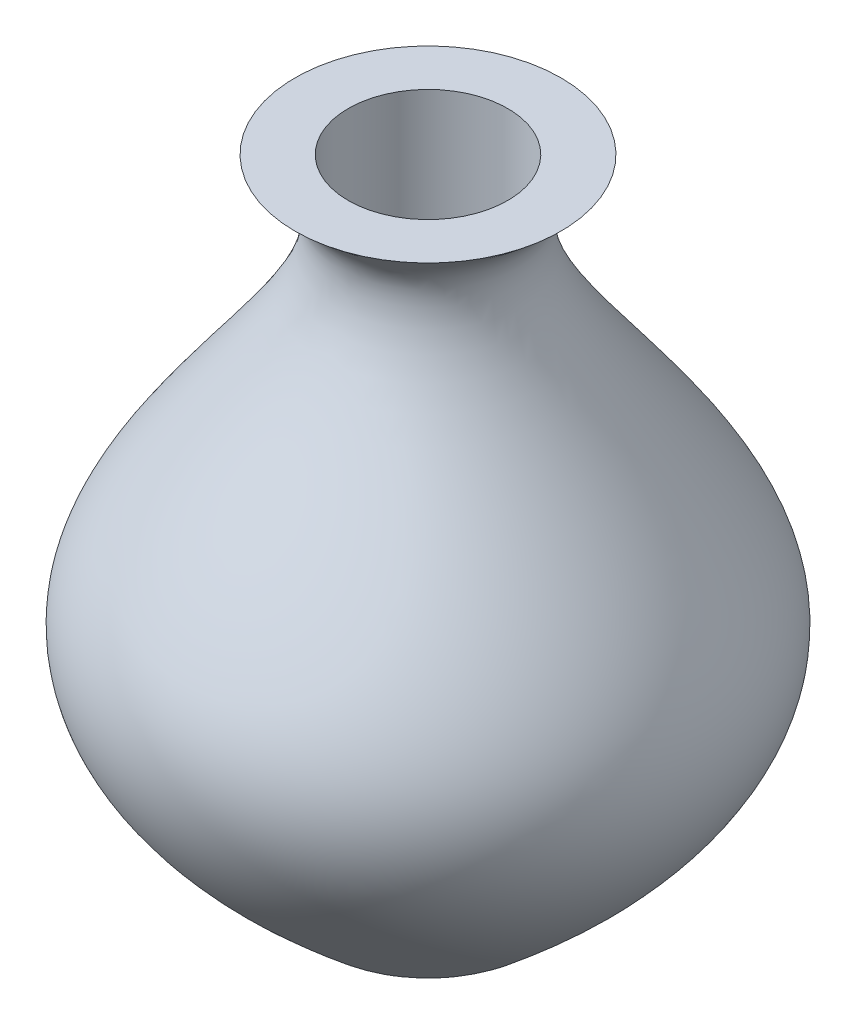
ISO-10303-21;
HEADER;
FILE_DESCRIPTION(('STEP AP214'),'2;1');
FILE_NAME('part.step','',(''),(''),'','','');
FILE_SCHEMA(('AUTOMOTIVE_DESIGN { 1 0 10303 214 1 1 1 1 }'));
ENDSEC;
DATA;
#1=APPLICATION_CONTEXT('core data for automotive mechanical design processes');
#2=APPLICATION_PROTOCOL_DEFINITION('international standard','automotive_design',2000,#1);
#3=PRODUCT_CONTEXT('',#1,'mechanical');
#4=PRODUCT('Part','Part','',(#3));
#5=PRODUCT_RELATED_PRODUCT_CATEGORY('part','',(#4));
#6=PRODUCT_DEFINITION_FORMATION('','',#4);
#7=PRODUCT_DEFINITION_CONTEXT('part definition',#1,'design');
#8=PRODUCT_DEFINITION('design','',#6,#7);
#9=PRODUCT_DEFINITION_SHAPE('','',#8);
#10=(LENGTH_UNIT() NAMED_UNIT(*) SI_UNIT(.MILLI.,.METRE.));
#11=(NAMED_UNIT(*) PLANE_ANGLE_UNIT() SI_UNIT($,.RADIAN.));
#12=(NAMED_UNIT(*) SI_UNIT($,.STERADIAN.) SOLID_ANGLE_UNIT());
#13=UNCERTAINTY_MEASURE_WITH_UNIT(LENGTH_MEASURE(1.E-05),#10,'distance_accuracy_value','');
#14=(GEOMETRIC_REPRESENTATION_CONTEXT(3) GLOBAL_UNCERTAINTY_ASSIGNED_CONTEXT((#13)) GLOBAL_UNIT_ASSIGNED_CONTEXT((#10,
#11,#12)) REPRESENTATION_CONTEXT('',''));
#15=CARTESIAN_POINT('',(0.,0.,0.));
#16=DIRECTION('',(0.,0.,1.));
#17=DIRECTION('',(1.,0.,0.));
#18=AXIS2_PLACEMENT_3D('',#15,#16,#17);
#19=CARTESIAN_POINT('',(0.,120.,0.));
#20=DIRECTION('',(0.,1.,0.));
#21=DIRECTION('',(0.,0.,1.));
#22=AXIS2_PLACEMENT_3D('',#19,#20,#21);
#23=PLANE('',#22);
#24=CARTESIAN_POINT('',(0.,120.,0.));
#25=DIRECTION('',(0.,1.,0.));
#26=DIRECTION('',(0.,0.,1.));
#27=AXIS2_PLACEMENT_3D('',#24,#25,#26);
#28=CIRCLE('',#27,15.);
#29=CARTESIAN_POINT('',(0.,120.,15.));
#30=VERTEX_POINT('',#29);
#31=EDGE_CURVE('E119',#30,#30,#28,.F.);
#32=ORIENTED_EDGE('',*,*,#31,.T.);
#33=EDGE_LOOP('',(#32));
#34=FACE_BOUND('',#33,.T.);
#35=CARTESIAN_POINT('',(0.,120.,0.));
#36=DIRECTION('',(0.,1.,0.));
#37=DIRECTION('',(0.,0.,1.));
#38=AXIS2_PLACEMENT_3D('',#35,#36,#37);
#39=CIRCLE('',#38,25.);
#40=CARTESIAN_POINT('',(0.,120.,25.));
#41=VERTEX_POINT('',#40);
#42=EDGE_CURVE('E11',#41,#41,#39,.T.);
#43=ORIENTED_EDGE('',*,*,#42,.T.);
#44=EDGE_LOOP('',(#43));
#45=FACE_BOUND('',#44,.T.);
#46=ADVANCED_FACE('F115',(#34,#45),#23,.T.);
#47=CARTESIAN_POINT('',(0.,0.,0.));
#48=DIRECTION('',(0.,1.,0.));
#49=DIRECTION('',(0.,0.,1.));
#50=AXIS2_PLACEMENT_3D('',#47,#48,#49);
#51=PLANE('',#50);
#52=CARTESIAN_POINT('',(0.,0.,0.));
#53=DIRECTION('',(0.,1.,0.));
#54=DIRECTION('',(0.,0.,1.));
#55=AXIS2_PLACEMENT_3D('',#52,#53,#54);
#56=CIRCLE('',#55,20.);
#57=CARTESIAN_POINT('',(0.,0.,20.));
#58=VERTEX_POINT('',#57);
#59=EDGE_CURVE('E123',#58,#58,#56,.T.);
#60=ORIENTED_EDGE('',*,*,#59,.F.);
#61=EDGE_LOOP('',(#60));
#62=FACE_BOUND('',#61,.T.);
#63=ADVANCED_FACE('F148',(#62),#51,.F.);
#64=CARTESIAN_POINT('',(-5.14400516611221,0.,19.3271625142185));
#65=CARTESIAN_POINT('',(-7.42194635237839,16.967937384597,39.766625762589));
#66=CARTESIAN_POINT('',(-10.9947943989979,50.3265774699418,69.8511464828441));
#67=CARTESIAN_POINT('',(2.87159985723646,99.4336032324122,9.31944506709552));
#68=CARTESIAN_POINT('',(-0.145396779369256,115.409113900686,18.9071613686045));
#69=CARTESIAN_POINT('',(-1.97713654584512,120.,24.9216959912259));
#70=CARTESIAN_POINT('',(-3.87904541415092,0.,19.6638368446705));
#71=CARTESIAN_POINT('',(-4.81919581688211,16.9679413236887,40.2523982572504));
#72=CARTESIAN_POINT('',(-6.42299583514226,50.3265729270069,70.5707610310723));
#73=CARTESIAN_POINT('',(3.48136860030306,99.4336094707994,9.131469425438));
#74=CARTESIAN_POINT('',(1.09214670084719,115.409111539105,18.9166891861028));
#75=CARTESIAN_POINT('',(-0.346015456221956,120.,25.0510992677175));
#76=CARTESIAN_POINT('',(-1.28249446036227,0.,20.0858396525019));
#77=CARTESIAN_POINT('',(0.482005136263627,16.9679397039652,40.7105737727381));
#78=CARTESIAN_POINT('',(2.86191107173391,50.32643296809,71.1111242604841));
#79=CARTESIAN_POINT('',(4.66449473363988,99.4339889754671,8.63274720272532));
#80=CARTESIAN_POINT('',(3.56849048824781,115.40896502202,18.6903331016542));
#81=CARTESIAN_POINT('',(2.94120267016632,120.,24.9874682366643));
#82=CARTESIAN_POINT('',(2.66087953735464,0.,19.9544200564198));
#83=CARTESIAN_POINT('',(8.41494993107207,16.9679505780328,39.8357981247999));
#84=CARTESIAN_POINT('',(16.6798184035074,50.3266389018482,69.1838412519339));
#85=CARTESIAN_POINT('',(6.25994129308448,99.4334176442034,7.56094624607444));
#86=CARTESIAN_POINT('',(7.14758772252509,115.409185698233,17.6383332037237));
#87=CARTESIAN_POINT('',(7.76094719073972,120.,23.9365528808286));
#88=CARTESIAN_POINT('',(6.50145431954131,0.,19.0481904038975));
#89=CARTESIAN_POINT('',(16.0245011012307,16.9679227311456,37.4273358609328));
#90=CARTESIAN_POINT('',(29.8570919840306,50.3265584976312,64.6018167623107));
#91=CARTESIAN_POINT('',(7.61322096640803,99.4336766618883,6.19296380785215));
#92=CARTESIAN_POINT('',(10.4492417997137,115.409085381841,15.9017542545208));
#93=CARTESIAN_POINT('',(12.2793430272255,120.,21.9584278528718));
#94=CARTESIAN_POINT('',(10.0946940420438,0.,17.4168335161775));
#95=CARTESIAN_POINT('',(23.0189405125275,16.9679518634664,33.5830957983455));
#96=CARTESIAN_POINT('',(41.8855653805382,50.3265932607307,57.5349482274476));
#97=CARTESIAN_POINT('',(8.67693816228554,99.4335386396055,4.58882760130199));
#98=CARTESIAN_POINT('',(13.3534504699347,115.4091390063,13.5604728692199));
#99=CARTESIAN_POINT('',(16.3303388144143,120.,19.1450167663631));
#100=CARTESIAN_POINT('',(13.2960628607081,0.,15.1100322145019));
#101=CARTESIAN_POINT('',(29.1275600220573,16.9679279126687,28.4459599063289));
#102=CARTESIAN_POINT('',(52.3064102884034,50.3265317982858,48.258770601839));
#103=CARTESIAN_POINT('',(9.40353468046937,99.4337406953524,2.80742135607709));
#104=CARTESIAN_POINT('',(15.7392435123768,115.409060724664,10.6926065331646));
#105=CARTESIAN_POINT('',(19.7478831870968,120.,15.5882432348716));
#106=CARTESIAN_POINT('',(15.9913347965985,0.,12.2282021137795));
#107=CARTESIAN_POINT('',(34.1183855090811,16.9679479125418,22.2178596653569));
#108=CARTESIAN_POINT('',(60.7149404730228,50.3266087186124,37.1262018766931));
#109=CARTESIAN_POINT('',(9.77241168022231,99.4335030152927,0.919601604587182));
#110=CARTESIAN_POINT('',(17.526347131095,115.409152711415,7.41808494881672));
#111=CARTESIAN_POINT('',(22.4138086465647,120.,11.4380283754441));
#112=CARTESIAN_POINT('',(18.066283870779,0.,8.87175882891875));
#113=CARTESIAN_POINT('',(37.7961382668,16.9679246135874,15.1340392354395));
#114=CARTESIAN_POINT('',(66.7926396726625,50.3265395950103,24.5683609237466));
#115=CARTESIAN_POINT('',(9.76214516409939,99.4337247166862,-1.00456012582283));
#116=CARTESIAN_POINT('',(18.6330100521281,115.409066853796,3.85551121868089));
#117=CARTESIAN_POINT('',(24.2099476941095,120.,6.84429330512717));
#118=CARTESIAN_POINT('',(19.4536489694016,0.,5.17761867223115));
#119=CARTESIAN_POINT('',(40.0237074076971,16.9679524758712,7.47003007181476));
#120=CARTESIAN_POINT('',(70.3007953475728,50.3266109096193,11.0656991974316));
#121=CARTESIAN_POINT('',(9.38062424359488,99.4334901621876,-2.89048272692094));
#122=CARTESIAN_POINT('',(19.0309669406534,115.409157726992,0.146360815474122));
#123=CARTESIAN_POINT('',(25.0846546702043,120.,1.99012026063089));
#124=CARTESIAN_POINT('',(20.0861689786182,0.,1.28269795602813));
#125=CARTESIAN_POINT('',(40.7106353621542,16.9679275758866,-0.481955723925191));
#126=CARTESIAN_POINT('',(71.1102514486357,50.3265393429255,-2.8621724099714));
#127=CARTESIAN_POINT('',(8.63461584252661,99.4337208837021,-4.66402959662714));
#128=CARTESIAN_POINT('',(18.6901027759906,115.409068368454,-3.5685348436849));
#129=CARTESIAN_POINT('',(24.9862839153223,120.,-2.9414085213348));
#130=CARTESIAN_POINT('',(19.9541884371488,0.,-2.66102794744871));
#131=CARTESIAN_POINT('',(39.8357296241011,16.9679504422772,-8.41497716740824));
#132=CARTESIAN_POINT('',(69.1842029064249,50.3266002746148,-16.6796793048532));
#133=CARTESIAN_POINT('',(7.56023720386086,99.433521909501,-6.26002511861989));
#134=CARTESIAN_POINT('',(17.6383816761938,115.409145447714,-7.1476396751648));
#135=CARTESIAN_POINT('',(23.9369421322354,120.,-7.76100406877463));
#136=CARTESIAN_POINT('',(19.048051883713,0.,-6.50158366595777));
#137=CARTESIAN_POINT('',(37.4272799004074,16.9679270283745,-16.0245528407614));
#138=CARTESIAN_POINT('',(64.6020271919977,50.3265350969549,-29.857029727071));
#139=CARTESIAN_POINT('',(6.19243524430079,99.4337331559427,-7.61328530709776));
#140=CARTESIAN_POINT('',(15.9017984329557,115.409063624599,-10.4492999317479));
#141=CARTESIAN_POINT('',(21.9587360237153,120.,-12.2793774096933));
#142=CARTESIAN_POINT('',(17.416946877871,0.,-10.0946807565622));
#143=CARTESIAN_POINT('',(33.5831509336434,16.9679524826826,-23.0189229264616));
#144=CARTESIAN_POINT('',(57.5347948768392,50.3266101937112,-41.8855562097003));
#145=CARTESIAN_POINT('',(4.58925635565357,99.4334920804096,-8.67690501613676));
#146=CARTESIAN_POINT('',(13.5604227221119,115.409156986592,-13.3534645423904));
#147=CARTESIAN_POINT('',(19.1447461003584,120.,-16.3303862043919));
#148=CARTESIAN_POINT('',(15.1100609791828,0.,-13.2960307763251));
#149=CARTESIAN_POINT('',(28.4459717330543,16.9679261380758,-29.1275411028062));
#150=CARTESIAN_POINT('',(48.258681995747,50.3265385626825,-52.30641670227));
#151=CARTESIAN_POINT('',(2.8076575297442,99.4337251756378,-9.40349558700191));
#152=CARTESIAN_POINT('',(10.6925547242551,115.409066694659,-15.7392306408031));
#153=CARTESIAN_POINT('',(15.5880528727608,120.,-19.7478881131714));
#154=CARTESIAN_POINT('',(12.2280903628022,0.,-15.9913595580221));
#155=CARTESIAN_POINT('',(22.2178422075221,16.9679516750316,-34.1183938483498));
#156=CARTESIAN_POINT('',(37.1263685234692,50.3265987775272,-60.7149203715058));
#157=CARTESIAN_POINT('',(0.919374856055031,99.4335240648378,-9.77241108448498));
#158=CARTESIAN_POINT('',(7.41806007000149,115.409144630282,-17.526330974786));
#159=CARTESIAN_POINT('',(11.4381019580968,120.,-22.413778856411));
#160=CARTESIAN_POINT('',(8.87173120388333,0.,-18.066392934429));
#161=CARTESIAN_POINT('',(15.134027999462,16.9679340114843,-37.7961865162484));
#162=CARTESIAN_POINT('',(24.5684023073638,50.3265341506978,-66.7925972255043));
#163=CARTESIAN_POINT('',(-1.004681267826,99.4337250686316,-9.76217145109397));
#164=CARTESIAN_POINT('',(3.855500777538,115.409066829082,-18.6330232806497));
#165=CARTESIAN_POINT('',(6.84433897354098,120.,-24.2099541544898));
#166=CARTESIAN_POINT('',(5.17770908466219,0.,-19.4537955735071));
#167=CARTESIAN_POINT('',(7.47006922685694,16.9679625456983,-40.0237739220661));
#168=CARTESIAN_POINT('',(11.0656380351637,50.326607328168,-70.3007510486447));
#169=CARTESIAN_POINT('',(-2.89037211223649,99.43348447228,-9.38064779811727));
#170=CARTESIAN_POINT('',(0.146362425427984,115.409160042525,-19.0310027499373));
#171=CARTESIAN_POINT('',(1.99006817000059,120.,-25.0846983931344));
#172=CARTESIAN_POINT('',(1.28274958737488,0.,-20.0862321432177));
#173=CARTESIAN_POINT('',(-0.481933621734429,16.9679319811622,-40.7106627789873));
#174=CARTESIAN_POINT('',(-2.86219935257105,50.3265361339217,-71.1102313961876));
#175=CARTESIAN_POINT('',(-4.66398041402687,99.433722818514,-8.63460668504873));
#176=CARTESIAN_POINT('',(-3.56851648723393,115.40906767367,-18.690108167751));
#177=CARTESIAN_POINT('',(-2.94140620161691,120.,-24.9862959580711));
#178=CARTESIAN_POINT('',(-2.66103897485741,0.,-19.9541636258976));
#179=CARTESIAN_POINT('',(-8.41500617315407,16.9679506559517,-39.8357235274815));
#180=CARTESIAN_POINT('',(-16.6797028595441,50.3265995435312,-69.1842207376661));
#181=CARTESIAN_POINT('',(-6.26009936914308,99.4335235535176,-7.56021535655989));
#182=CARTESIAN_POINT('',(-7.14760571676779,115.409144815612,-17.6383545366461));
#183=CARTESIAN_POINT('',(-7.76091856134609,120.,-23.9369129612001));
#184=CARTESIAN_POINT('',(-6.50154828891349,0.,-19.0480510038831));
#185=CARTESIAN_POINT('',(-16.0245462108774,16.9679257785871,-37.4272732154569));
#186=CARTESIAN_POINT('',(-29.8570433477478,50.3265384802488,-64.6020036758222));
#187=CARTESIAN_POINT('',(-7.61331861392753,99.433725945269,-6.19246286407034));
#188=CARTESIAN_POINT('',(-10.449259749294,115.409066393312,-15.9017923126244));
#189=CARTESIAN_POINT('',(-12.2793033292215,120.,-21.9587155144214));
#190=CARTESIAN_POINT('',(-10.0945995501676,0.,-17.4169939439974));
#191=CARTESIAN_POINT('',(-23.0188968732263,16.9679493101398,-33.5831624534461));
#192=CARTESIAN_POINT('',(-41.8856102282343,50.326613192735,-57.5347521435959));
#193=CARTESIAN_POINT('',(-8.67686445522066,99.4334888336063,-4.58930542861377));
#194=CARTESIAN_POINT('',(-13.3534335054258,115.409158202416,-13.560453148281));
#195=CARTESIAN_POINT('',(-16.3303621542,120.,-19.1447666150428));
#196=CARTESIAN_POINT('',(-13.296013953994,0.,-15.1100921130637));
#197=CARTESIAN_POINT('',(-29.1275410879293,16.9679250001546,-28.4459783332109));
#198=CARTESIAN_POINT('',(-52.3064443803752,50.3265371453304,-48.2586752170402));
#199=CARTESIAN_POINT('',(-9.40348229564108,99.4337307271107,-2.80762163781851));
#200=CARTESIAN_POINT('',(-15.739232721767,115.409064538199,-10.6925959964763));
#201=CARTESIAN_POINT('',(-19.7478966852382,120.,-15.5881292603718));
#202=CARTESIAN_POINT('',(-15.9913865683179,0.,-12.2280931279151));
#203=CARTESIAN_POINT('',(-34.1184077580807,16.9679512582424,-22.2178204765942));
#204=CARTESIAN_POINT('',(-60.7149131768095,50.326599135809,-37.1263442227036));
#205=CARTESIAN_POINT('',(-9.77244559425781,99.433523734496,-0.919294397035548));
#206=CARTESIAN_POINT('',(-17.526353101115,115.409144752873,-7.41809425961114));
#207=CARTESIAN_POINT('',(-22.4137941801181,120.,-11.438190995469));
#208=CARTESIAN_POINT('',(-18.0663124610648,0.,-8.87174460538509));
#209=CARTESIAN_POINT('',(-37.796149909337,16.9679261666341,-15.1340330367615));
#210=CARTESIAN_POINT('',(-66.7926194511123,50.3265406599717,-24.5683863262996));
#211=CARTESIAN_POINT('',(-9.76218487748304,99.4337194822192,1.00462987743574));
#212=CARTESIAN_POINT('',(-18.6330184984042,115.409068892794,-3.85551804776191));
#213=CARTESIAN_POINT('',(-24.2099418966214,120.,-6.84433936539494));
#214=CARTESIAN_POINT('',(-19.453623422125,0.,-5.17771465898657));
#215=CARTESIAN_POINT('',(-40.0236946908628,16.9679489526206,-7.47006818885915));
#216=CARTESIAN_POINT('',(-70.3008030459281,50.3266149606297,-11.0655960675015));
#217=CARTESIAN_POINT('',(-9.38062152596299,99.433484615608,2.89025381502202));
#218=CARTESIAN_POINT('',(-19.0309706927753,115.409159826436,-0.146363294705812));
#219=CARTESIAN_POINT('',(-25.0846634305519,120.,-1.99000983693784));
#220=CARTESIAN_POINT('',(-20.0861512413892,0.,-1.28267140223256));
#221=CARTESIAN_POINT('',(-40.7106294693818,16.9679278314858,0.481968025677448));
#222=CARTESIAN_POINT('',(-71.1102681869873,50.3265360407486,2.86214383518321));
#223=CARTESIAN_POINT('',(-8.63457998713504,99.4337293901689,4.6640989977326));
#224=CARTESIAN_POINT('',(-18.6900916675042,115.409065087776,3.56852669355878));
#225=CARTESIAN_POINT('',(-24.9862823777135,120.,2.94136212311404));
#226=CARTESIAN_POINT('',(-19.9541976913733,0.,2.66114824952224));
#227=CARTESIAN_POINT('',(-39.8357366739862,16.9679555586921,8.41502183991967));
#228=CARTESIAN_POINT('',(-69.1842071934197,50.3266000072736,16.6795355353822));
#229=CARTESIAN_POINT('',(-7.56021562122166,99.4335148365374,6.26032685932016));
#230=CARTESIAN_POINT('',(-17.638364544014,115.409148238559,7.14763115488529));
#231=CARTESIAN_POINT('',(-23.936930776526,120.,7.76084120196269));
#232=CARTESIAN_POINT('',(-19.0480645445932,0.,6.50150738092314));
#233=CARTESIAN_POINT('',(-37.4272821480577,16.9679239265068,16.024526600402));
#234=CARTESIAN_POINT('',(-64.6020090580696,50.3265368067721,29.8571287025502));
#235=CARTESIAN_POINT('',(-6.19247876525415,99.4337332745038,7.61308910015878));
#236=CARTESIAN_POINT('',(-15.9018164849957,115.409063542147,10.4493108476691));
#237=CARTESIAN_POINT('',(-21.9587406654096,120.,12.2794920868101));
#238=CARTESIAN_POINT('',(-17.4169491202129,0.,10.0944945825253));
#239=CARTESIAN_POINT('',(-33.5831474051224,16.9679441047743,23.0188429259936));
#240=CARTESIAN_POINT('',(-57.534780309989,50.326602905403,41.8857537612743));
#241=CARTESIAN_POINT('',(-4.58930475413738,99.4335244754593,8.67644014960174));
#242=CARTESIAN_POINT('',(-13.5604592495949,115.409144382241,13.3534822819145));
#243=CARTESIAN_POINT('',(-19.1447624952669,120.,16.3306369066768));
#244=CARTESIAN_POINT('',(-15.1100487373961,0.,13.2961984448838));
#245=CARTESIAN_POINT('',(-28.445970338675,16.9679336439472,29.1276190605532));
#246=CARTESIAN_POINT('',(-48.258704816575,50.3265457585443,52.3062285913136));
#247=CARTESIAN_POINT('',(-2.80759113980941,99.4336943578898,9.40398268124333));
#248=CARTESIAN_POINT('',(-10.6925153638127,115.409078679821,15.7391942774554));
#249=CARTESIAN_POINT('',(-15.5880467170009,120.,19.7475977905831));
#250=CARTESIAN_POINT('',(-12.2280794898712,0.,15.9916613173789));
#251=CARTESIAN_POINT('',(-22.2178516352262,16.9679650561342,34.1184874947466));
#252=CARTESIAN_POINT('',(-37.1264092985408,50.3266240651986,60.7145291381605));
#253=CARTESIAN_POINT('',(-0.919263985879236,99.4334355603113,9.77313268338092));
#254=CARTESIAN_POINT('',(-7.41800896993715,115.409178953412,17.5263081492152));
#255=CARTESIAN_POINT('',(-11.4380734535096,120.,22.4134187661381));
#256=CARTESIAN_POINT('',(-8.87175747136638,0.,18.0659255493909));
#257=CARTESIAN_POINT('',(-15.1340025759504,16.9679160694151,37.796070684371));
#258=CARTESIAN_POINT('',(-24.5682790131404,50.3264602257,66.7935172459472));
#259=CARTESIAN_POINT('',(1.00433881854126,99.433951545144,9.76030647567803));
#260=CARTESIAN_POINT('',(-3.85556935316918,115.408979191507,18.6332614799008));
#261=CARTESIAN_POINT('',(-6.84432282769098,120.,24.2111438609507));
#262=CARTESIAN_POINT('',(-6.4089649180735,0.,18.9904881837664));
#263=CARTESIAN_POINT('',(-10.0246968878747,16.9679334455053,39.2808532679276));
#264=CARTESIAN_POINT('',(-15.5665929628535,50.3265820128768,69.1315319346159));
#265=CARTESIAN_POINT('',(2.26183111416986,99.4335969940251,9.50742070875304));
#266=CARTESIAN_POINT('',(-1.3829402595857,115.409116262267,18.8976335511063));
#267=CARTESIAN_POINT('',(-3.60825763546829,120.,24.7922927147343));
#268=CARTESIAN_POINT('',(-5.14400516611221,0.,19.3271625142185));
#269=CARTESIAN_POINT('',(-7.42194635237839,16.967937384597,39.766625762589));
#270=CARTESIAN_POINT('',(-10.9947943989979,50.3265774699418,69.8511464828441));
#271=CARTESIAN_POINT('',(2.87159985723646,99.4336032324122,9.31944506709552));
#272=CARTESIAN_POINT('',(-0.145396779369256,115.409113900686,18.9071613686045));
#273=CARTESIAN_POINT('',(-1.97713654584512,120.,24.9216959912259));
#274=B_SPLINE_SURFACE_WITH_KNOTS('',3,3,((#64,#65,#66,#67,#68,#69),(#70,#71,#72,#73,#74,#75),
(#76,#77,#78,#79,#80,#81),(#82,#83,#84,#85,#86,#87),(#88,#89,#90,#91,#92,#93),(#94,#95,#96,#97,
#98,#99),(#100,#101,#102,#103,#104,#105),(#106,#107,#108,#109,#110,#111),(#112,#113,#114,#115,
#116,#117),(#118,#119,#120,#121,#122,#123),(#124,#125,#126,#127,#128,#129),(#130,#131,#132,#133,
#134,#135),(#136,#137,#138,#139,#140,#141),(#142,#143,#144,#145,#146,#147),(#148,#149,#150,#151,
#152,#153),(#154,#155,#156,#157,#158,#159),(#160,#161,#162,#163,#164,#165),(#166,#167,#168,#169,
#170,#171),(#172,#173,#174,#175,#176,#177),(#178,#179,#180,#181,#182,#183),(#184,#185,#186,#187,
#188,#189),(#190,#191,#192,#193,#194,#195),(#196,#197,#198,#199,#200,#201),(#202,#203,#204,#205,
#206,#207),(#208,#209,#210,#211,#212,#213),(#214,#215,#216,#217,#218,#219),(#220,#221,#222,#223,
#224,#225),(#226,#227,#228,#229,#230,#231),(#232,#233,#234,#235,#236,#237),(#238,#239,#240,#241,
#242,#243),(#244,#245,#246,#247,#248,#249),(#250,#251,#252,#253,#254,#255),(#256,#257,#258,#259,
#260,#261),(#262,#263,#264,#265,#266,#267),(#268,#269,#270,#271,#272,#273)),.UNSPECIFIED.,.T.,
.F.,.F.,(4,1,1,1,1,1,1,1,1,1,1,1,1,1,1,1,1,1,1,1,1,1,1,1,1,1,1,1,1,1,1,1,4),(4,1,1,4),(0.,
0.03125,0.0625,0.09375,0.125,0.15625,0.1875,0.21875,0.25,0.28125,0.3125,0.34375,0.375,0.40625,
0.4375,0.46875,0.5,0.53125,0.5625,0.59375,0.625,0.65625,0.6875,0.71875,0.75,0.78125,0.8125,
0.84375,0.875,0.90625,0.9375,0.96875,1.),(0.,0.4169913821658,0.907155985035644,1.),.UNSPECIFIED.);
#275=ORIENTED_EDGE('',*,*,#59,.T.);
#276=EDGE_LOOP('',(#275));
#277=FACE_BOUND('',#276,.T.);
#278=ORIENTED_EDGE('',*,*,#42,.F.);
#279=EDGE_LOOP('',(#278));
#280=FACE_BOUND('',#279,.T.);
#281=ADVANCED_FACE('F157',(#277,#280),#274,.T.);
#282=CARTESIAN_POINT('',(0.,120.01183593329,0.));
#283=DIRECTION('',(0.,-1.,0.));
#284=DIRECTION('',(0.,0.,-1.));
#285=AXIS2_PLACEMENT_3D('',#282,#283,#284);
#286=CYLINDRICAL_SURFACE('',#285,15.);
#287=ORIENTED_EDGE('',*,*,#31,.F.);
#288=EDGE_LOOP('',(#287));
#289=FACE_BOUND('',#288,.T.);
#290=CARTESIAN_POINT('',(0.,10.,0.));
#291=DIRECTION('',(0.,1.,0.));
#292=DIRECTION('',(0.,0.,1.));
#293=AXIS2_PLACEMENT_3D('',#290,#291,#292);
#294=CIRCLE('',#293,15.);
#295=CARTESIAN_POINT('',(0.,10.,15.));
#296=VERTEX_POINT('',#295);
#297=EDGE_CURVE('E191',#296,#296,#294,.T.);
#298=ORIENTED_EDGE('',*,*,#297,.F.);
#299=EDGE_LOOP('',(#298));
#300=FACE_BOUND('',#299,.T.);
#301=ADVANCED_FACE('F159',(#289,#300),#286,.F.);
#302=CARTESIAN_POINT('',(0.,10.,0.));
#303=DIRECTION('',(0.,1.,0.));
#304=DIRECTION('',(0.,0.,1.));
#305=AXIS2_PLACEMENT_3D('',#302,#303,#304);
#306=PLANE('',#305);
#307=ORIENTED_EDGE('',*,*,#297,.T.);
#308=EDGE_LOOP('',(#307));
#309=FACE_BOUND('',#308,.T.);
#310=ADVANCED_FACE('F201',(#309),#306,.T.);
#311=CLOSED_SHELL('',(#46,#63,#281,#301,#310));
#312=MANIFOLD_SOLID_BREP('B2',#311);
#313=ADVANCED_BREP_SHAPE_REPRESENTATION('',(#18,#312),#14);
#314=SHAPE_DEFINITION_REPRESENTATION(#9,#313);
ENDSEC;
END-ISO-10303-21;
